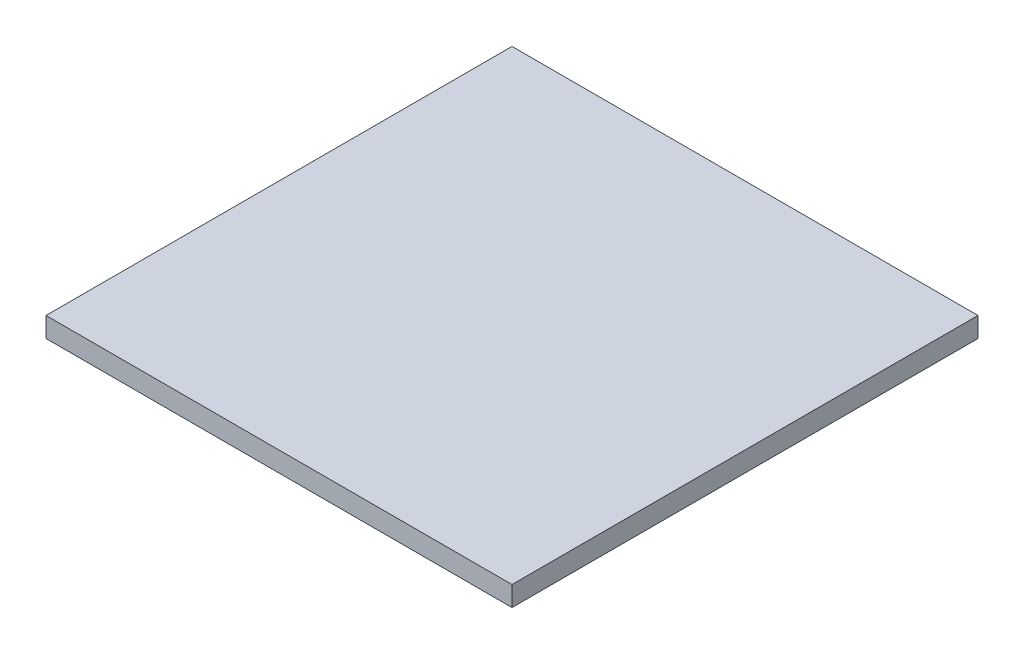
ISO-10303-21;
HEADER;
FILE_DESCRIPTION(('STEP AP214'),'2;1');
FILE_NAME('part.step','',(''),(''),'','','');
FILE_SCHEMA(('AUTOMOTIVE_DESIGN { 1 0 10303 214 1 1 1 1 }'));
ENDSEC;
DATA;
#1=APPLICATION_CONTEXT('core data for automotive mechanical design processes');
#2=APPLICATION_PROTOCOL_DEFINITION('international standard','automotive_design',2000,#1);
#3=PRODUCT_CONTEXT('',#1,'mechanical');
#4=PRODUCT('Part','Part','',(#3));
#5=PRODUCT_RELATED_PRODUCT_CATEGORY('part','',(#4));
#6=PRODUCT_DEFINITION_FORMATION('','',#4);
#7=PRODUCT_DEFINITION_CONTEXT('part definition',#1,'design');
#8=PRODUCT_DEFINITION('design','',#6,#7);
#9=PRODUCT_DEFINITION_SHAPE('','',#8);
#10=(LENGTH_UNIT() NAMED_UNIT(*) SI_UNIT(.MILLI.,.METRE.));
#11=(NAMED_UNIT(*) PLANE_ANGLE_UNIT() SI_UNIT($,.RADIAN.));
#12=(NAMED_UNIT(*) SI_UNIT($,.STERADIAN.) SOLID_ANGLE_UNIT());
#13=UNCERTAINTY_MEASURE_WITH_UNIT(LENGTH_MEASURE(1.E-05),#10,'distance_accuracy_value','');
#14=(GEOMETRIC_REPRESENTATION_CONTEXT(3) GLOBAL_UNCERTAINTY_ASSIGNED_CONTEXT((#13)) GLOBAL_UNIT_ASSIGNED_CONTEXT((#10,
#11,#12)) REPRESENTATION_CONTEXT('',''));
#15=CARTESIAN_POINT('',(0.,0.,0.));
#16=DIRECTION('',(0.,0.,1.));
#17=DIRECTION('',(1.,0.,0.));
#18=AXIS2_PLACEMENT_3D('',#15,#16,#17);
#19=CARTESIAN_POINT('',(0.,30.48,0.));
#20=DIRECTION('',(1.,0.,0.));
#21=DIRECTION('',(0.,0.,-1.));
#22=AXIS2_PLACEMENT_3D('',#19,#20,#21);
#23=PLANE('',#22);
#24=DIRECTION('',(0.,0.,1.));
#25=VECTOR('',#24,1.);
#26=CARTESIAN_POINT('',(0.,0.,0.));
#27=LINE('',#26,#25);
#28=CARTESIAN_POINT('',(0.,0.,0.));
#29=VERTEX_POINT('',#28);
#30=CARTESIAN_POINT('',(0.,0.,711.2));
#31=VERTEX_POINT('',#30);
#32=EDGE_CURVE('E111',#29,#31,#27,.T.);
#33=ORIENTED_EDGE('',*,*,#32,.T.);
#34=DIRECTION('',(0.,-1.,0.));
#35=VECTOR('',#34,1.);
#36=CARTESIAN_POINT('',(0.,30.48,711.2));
#37=LINE('',#36,#35);
#38=CARTESIAN_POINT('',(0.,30.48,711.2));
#39=VERTEX_POINT('',#38);
#40=EDGE_CURVE('E11',#39,#31,#37,.T.);
#41=ORIENTED_EDGE('',*,*,#40,.F.);
#42=DIRECTION('',(0.,0.,1.));
#43=VECTOR('',#42,1.);
#44=CARTESIAN_POINT('',(0.,30.48,0.));
#45=LINE('',#44,#43);
#46=CARTESIAN_POINT('',(0.,30.48,0.));
#47=VERTEX_POINT('',#46);
#48=EDGE_CURVE('E95',#47,#39,#45,.T.);
#49=ORIENTED_EDGE('',*,*,#48,.F.);
#50=DIRECTION('',(0.,-1.,0.));
#51=VECTOR('',#50,1.);
#52=CARTESIAN_POINT('',(0.,30.48,0.));
#53=LINE('',#52,#51);
#54=EDGE_CURVE('E107',#47,#29,#53,.T.);
#55=ORIENTED_EDGE('',*,*,#54,.T.);
#56=EDGE_LOOP('',(#33,#41,#49,#55));
#57=FACE_BOUND('',#56,.T.);
#58=ADVANCED_FACE('F43',(#57),#23,.F.);
#59=CARTESIAN_POINT('',(0.,30.48,711.2));
#60=DIRECTION('',(0.,0.,-1.));
#61=DIRECTION('',(-1.,0.,0.));
#62=AXIS2_PLACEMENT_3D('',#59,#60,#61);
#63=PLANE('',#62);
#64=DIRECTION('',(1.,0.,0.));
#65=VECTOR('',#64,1.);
#66=CARTESIAN_POINT('',(0.,0.,711.2));
#67=LINE('',#66,#65);
#68=CARTESIAN_POINT('',(711.2,0.,711.2));
#69=VERTEX_POINT('',#68);
#70=EDGE_CURVE('E100',#31,#69,#67,.T.);
#71=ORIENTED_EDGE('',*,*,#70,.T.);
#72=DIRECTION('',(0.,-1.,0.));
#73=VECTOR('',#72,1.);
#74=CARTESIAN_POINT('',(711.2,30.48,711.2));
#75=LINE('',#74,#73);
#76=CARTESIAN_POINT('',(711.2,30.48,711.2));
#77=VERTEX_POINT('',#76);
#78=EDGE_CURVE('E52',#77,#69,#75,.T.);
#79=ORIENTED_EDGE('',*,*,#78,.F.);
#80=DIRECTION('',(1.,0.,0.));
#81=VECTOR('',#80,1.);
#82=CARTESIAN_POINT('',(0.,30.48,711.2));
#83=LINE('',#82,#81);
#84=EDGE_CURVE('E90',#39,#77,#83,.T.);
#85=ORIENTED_EDGE('',*,*,#84,.F.);
#86=ORIENTED_EDGE('',*,*,#40,.T.);
#87=EDGE_LOOP('',(#71,#79,#85,#86));
#88=FACE_BOUND('',#87,.T.);
#89=ADVANCED_FACE('F99',(#88),#63,.F.);
#90=CARTESIAN_POINT('',(711.2,30.48,0.));
#91=DIRECTION('',(-1.,0.,0.));
#92=DIRECTION('',(0.,0.,1.));
#93=AXIS2_PLACEMENT_3D('',#90,#91,#92);
#94=PLANE('',#93);
#95=DIRECTION('',(0.,0.,-1.));
#96=VECTOR('',#95,1.);
#97=CARTESIAN_POINT('',(711.2,0.,0.));
#98=LINE('',#97,#96);
#99=CARTESIAN_POINT('',(711.2,0.,0.));
#100=VERTEX_POINT('',#99);
#101=EDGE_CURVE('E77',#69,#100,#98,.T.);
#102=ORIENTED_EDGE('',*,*,#101,.T.);
#103=DIRECTION('',(0.,-1.,0.));
#104=VECTOR('',#103,1.);
#105=CARTESIAN_POINT('',(711.2,30.48,0.));
#106=LINE('',#105,#104);
#107=CARTESIAN_POINT('',(711.2,30.48,0.));
#108=VERTEX_POINT('',#107);
#109=EDGE_CURVE('E102',#108,#100,#106,.T.);
#110=ORIENTED_EDGE('',*,*,#109,.F.);
#111=DIRECTION('',(0.,0.,-1.));
#112=VECTOR('',#111,1.);
#113=CARTESIAN_POINT('',(711.2,30.48,0.));
#114=LINE('',#113,#112);
#115=EDGE_CURVE('E93',#77,#108,#114,.T.);
#116=ORIENTED_EDGE('',*,*,#115,.F.);
#117=ORIENTED_EDGE('',*,*,#78,.T.);
#118=EDGE_LOOP('',(#102,#110,#116,#117));
#119=FACE_BOUND('',#118,.T.);
#120=ADVANCED_FACE('F103',(#119),#94,.F.);
#121=CARTESIAN_POINT('',(0.,30.48,0.));
#122=DIRECTION('',(0.,0.,1.));
#123=DIRECTION('',(1.,0.,0.));
#124=AXIS2_PLACEMENT_3D('',#121,#122,#123);
#125=PLANE('',#124);
#126=DIRECTION('',(-1.,0.,0.));
#127=VECTOR('',#126,1.);
#128=CARTESIAN_POINT('',(0.,0.,0.));
#129=LINE('',#128,#127);
#130=EDGE_CURVE('E83',#100,#29,#129,.T.);
#131=ORIENTED_EDGE('',*,*,#130,.T.);
#132=ORIENTED_EDGE('',*,*,#54,.F.);
#133=DIRECTION('',(-1.,0.,0.));
#134=VECTOR('',#133,1.);
#135=CARTESIAN_POINT('',(0.,30.48,0.));
#136=LINE('',#135,#134);
#137=EDGE_CURVE('E60',#108,#47,#136,.T.);
#138=ORIENTED_EDGE('',*,*,#137,.F.);
#139=ORIENTED_EDGE('',*,*,#109,.T.);
#140=EDGE_LOOP('',(#131,#132,#138,#139));
#141=FACE_BOUND('',#140,.T.);
#142=ADVANCED_FACE('F124',(#141),#125,.F.);
#143=CARTESIAN_POINT('',(0.,30.48,0.));
#144=DIRECTION('',(0.,1.,0.));
#145=DIRECTION('',(0.,0.,1.));
#146=AXIS2_PLACEMENT_3D('',#143,#144,#145);
#147=PLANE('',#146);
#148=ORIENTED_EDGE('',*,*,#48,.T.);
#149=ORIENTED_EDGE('',*,*,#84,.T.);
#150=ORIENTED_EDGE('',*,*,#115,.T.);
#151=ORIENTED_EDGE('',*,*,#137,.T.);
#152=EDGE_LOOP('',(#148,#149,#150,#151));
#153=FACE_BOUND('',#152,.T.);
#154=ADVANCED_FACE('F91',(#153),#147,.T.);
#155=CARTESIAN_POINT('',(0.,0.,0.));
#156=DIRECTION('',(0.,1.,0.));
#157=DIRECTION('',(0.,0.,1.));
#158=AXIS2_PLACEMENT_3D('',#155,#156,#157);
#159=PLANE('',#158);
#160=ORIENTED_EDGE('',*,*,#32,.F.);
#161=ORIENTED_EDGE('',*,*,#130,.F.);
#162=ORIENTED_EDGE('',*,*,#101,.F.);
#163=ORIENTED_EDGE('',*,*,#70,.F.);
#164=EDGE_LOOP('',(#160,#161,#162,#163));
#165=FACE_BOUND('',#164,.T.);
#166=ADVANCED_FACE('F127',(#165),#159,.F.);
#167=CLOSED_SHELL('',(#58,#89,#120,#142,#154,#166));
#168=MANIFOLD_SOLID_BREP('B2',#167);
#169=ADVANCED_BREP_SHAPE_REPRESENTATION('',(#18,#168),#14);
#170=SHAPE_DEFINITION_REPRESENTATION(#9,#169);
ENDSEC;
END-ISO-10303-21;
